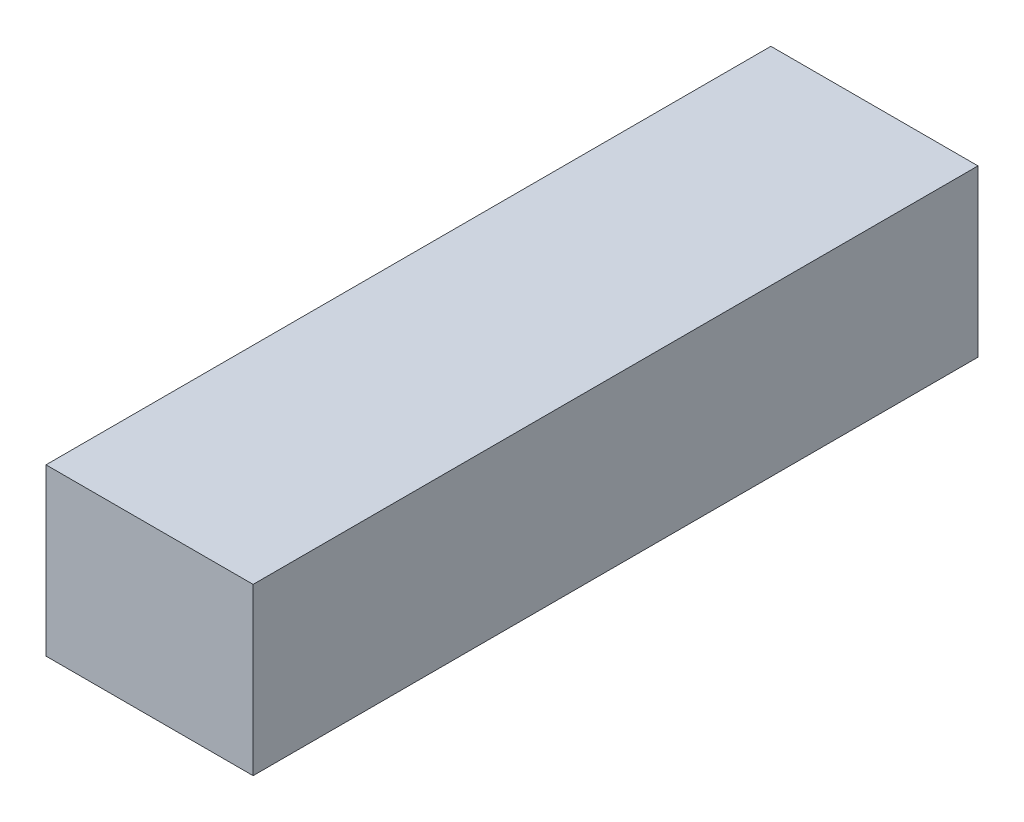
ISO-10303-21;
HEADER;
FILE_DESCRIPTION(('STEP AP214'),'2;1');
FILE_NAME('part.step','',(''),(''),'','','');
FILE_SCHEMA(('AUTOMOTIVE_DESIGN { 1 0 10303 214 1 1 1 1 }'));
ENDSEC;
DATA;
#1=APPLICATION_CONTEXT('core data for automotive mechanical design processes');
#2=APPLICATION_PROTOCOL_DEFINITION('international standard','automotive_design',2000,#1);
#3=PRODUCT_CONTEXT('',#1,'mechanical');
#4=PRODUCT('Part','Part','',(#3));
#5=PRODUCT_RELATED_PRODUCT_CATEGORY('part','',(#4));
#6=PRODUCT_DEFINITION_FORMATION('','',#4);
#7=PRODUCT_DEFINITION_CONTEXT('part definition',#1,'design');
#8=PRODUCT_DEFINITION('design','',#6,#7);
#9=PRODUCT_DEFINITION_SHAPE('','',#8);
#10=(LENGTH_UNIT() NAMED_UNIT(*) SI_UNIT(.MILLI.,.METRE.));
#11=(NAMED_UNIT(*) PLANE_ANGLE_UNIT() SI_UNIT($,.RADIAN.));
#12=(NAMED_UNIT(*) SI_UNIT($,.STERADIAN.) SOLID_ANGLE_UNIT());
#13=UNCERTAINTY_MEASURE_WITH_UNIT(LENGTH_MEASURE(1.E-05),#10,'distance_accuracy_value','');
#14=(GEOMETRIC_REPRESENTATION_CONTEXT(3) GLOBAL_UNCERTAINTY_ASSIGNED_CONTEXT((#13)) GLOBAL_UNIT_ASSIGNED_CONTEXT((#10,
#11,#12)) REPRESENTATION_CONTEXT('',''));
#15=CARTESIAN_POINT('',(0.,0.,0.));
#16=DIRECTION('',(0.,0.,1.));
#17=DIRECTION('',(1.,0.,0.));
#18=AXIS2_PLACEMENT_3D('',#15,#16,#17);
#19=CARTESIAN_POINT('',(-12.7,20.32,44.45));
#20=DIRECTION('',(0.,0.,-1.));
#21=DIRECTION('',(-1.,0.,0.));
#22=AXIS2_PLACEMENT_3D('',#19,#20,#21);
#23=PLANE('',#22);
#24=DIRECTION('',(1.,0.,0.));
#25=VECTOR('',#24,1.);
#26=CARTESIAN_POINT('',(-12.7,0.,44.45));
#27=LINE('',#26,#25);
#28=CARTESIAN_POINT('',(-12.7,0.,44.45));
#29=VERTEX_POINT('',#28);
#30=CARTESIAN_POINT('',(12.7,0.,44.45));
#31=VERTEX_POINT('',#30);
#32=EDGE_CURVE('E106',#29,#31,#27,.T.);
#33=ORIENTED_EDGE('',*,*,#32,.T.);
#34=DIRECTION('',(0.,-1.,0.));
#35=VECTOR('',#34,1.);
#36=CARTESIAN_POINT('',(12.7,20.32,44.45));
#37=LINE('',#36,#35);
#38=CARTESIAN_POINT('',(12.7,20.32,44.45));
#39=VERTEX_POINT('',#38);
#40=EDGE_CURVE('E11',#39,#31,#37,.T.);
#41=ORIENTED_EDGE('',*,*,#40,.F.);
#42=DIRECTION('',(1.,0.,0.));
#43=VECTOR('',#42,1.);
#44=CARTESIAN_POINT('',(-12.7,20.32,44.45));
#45=LINE('',#44,#43);
#46=CARTESIAN_POINT('',(-12.7,20.32,44.45));
#47=VERTEX_POINT('',#46);
#48=EDGE_CURVE('E93',#47,#39,#45,.T.);
#49=ORIENTED_EDGE('',*,*,#48,.F.);
#50=DIRECTION('',(0.,-1.,0.));
#51=VECTOR('',#50,1.);
#52=CARTESIAN_POINT('',(-12.7,20.32,44.45));
#53=LINE('',#52,#51);
#54=EDGE_CURVE('E62',#47,#29,#53,.T.);
#55=ORIENTED_EDGE('',*,*,#54,.T.);
#56=EDGE_LOOP('',(#33,#41,#49,#55));
#57=FACE_BOUND('',#56,.T.);
#58=ADVANCED_FACE('F44',(#57),#23,.F.);
#59=CARTESIAN_POINT('',(12.7,20.32,44.45));
#60=DIRECTION('',(-1.,0.,0.));
#61=DIRECTION('',(0.,0.,1.));
#62=AXIS2_PLACEMENT_3D('',#59,#60,#61);
#63=PLANE('',#62);
#64=DIRECTION('',(0.,0.,-1.));
#65=VECTOR('',#64,1.);
#66=CARTESIAN_POINT('',(12.7,0.,44.45));
#67=LINE('',#66,#65);
#68=CARTESIAN_POINT('',(12.7,0.,-44.45));
#69=VERTEX_POINT('',#68);
#70=EDGE_CURVE('E96',#31,#69,#67,.T.);
#71=ORIENTED_EDGE('',*,*,#70,.T.);
#72=DIRECTION('',(0.,-1.,0.));
#73=VECTOR('',#72,1.);
#74=CARTESIAN_POINT('',(12.7,20.32,-44.45));
#75=LINE('',#74,#73);
#76=CARTESIAN_POINT('',(12.7,20.32,-44.45));
#77=VERTEX_POINT('',#76);
#78=EDGE_CURVE('E52',#77,#69,#75,.T.);
#79=ORIENTED_EDGE('',*,*,#78,.F.);
#80=DIRECTION('',(0.,0.,-1.));
#81=VECTOR('',#80,1.);
#82=CARTESIAN_POINT('',(12.7,20.32,44.45));
#83=LINE('',#82,#81);
#84=EDGE_CURVE('E87',#39,#77,#83,.T.);
#85=ORIENTED_EDGE('',*,*,#84,.F.);
#86=ORIENTED_EDGE('',*,*,#40,.T.);
#87=EDGE_LOOP('',(#71,#79,#85,#86));
#88=FACE_BOUND('',#87,.T.);
#89=ADVANCED_FACE('F100',(#88),#63,.F.);
#90=CARTESIAN_POINT('',(-12.7,20.32,-44.45));
#91=DIRECTION('',(0.,0.,-1.));
#92=DIRECTION('',(-1.,0.,0.));
#93=AXIS2_PLACEMENT_3D('',#90,#91,#92);
#94=PLANE('',#93);
#95=DIRECTION('',(1.,0.,0.));
#96=VECTOR('',#95,1.);
#97=CARTESIAN_POINT('',(-12.7,0.,-44.45));
#98=LINE('',#97,#96);
#99=CARTESIAN_POINT('',(-12.7,0.,-44.45));
#100=VERTEX_POINT('',#99);
#101=EDGE_CURVE('E113',#100,#69,#98,.T.);
#102=ORIENTED_EDGE('',*,*,#101,.F.);
#103=DIRECTION('',(0.,-1.,0.));
#104=VECTOR('',#103,1.);
#105=CARTESIAN_POINT('',(-12.7,20.32,-44.45));
#106=LINE('',#105,#104);
#107=CARTESIAN_POINT('',(-12.7,20.32,-44.45));
#108=VERTEX_POINT('',#107);
#109=EDGE_CURVE('E73',#108,#100,#106,.T.);
#110=ORIENTED_EDGE('',*,*,#109,.F.);
#111=DIRECTION('',(1.,0.,0.));
#112=VECTOR('',#111,1.);
#113=CARTESIAN_POINT('',(-12.7,20.32,-44.45));
#114=LINE('',#113,#112);
#115=EDGE_CURVE('E92',#108,#77,#114,.T.);
#116=ORIENTED_EDGE('',*,*,#115,.T.);
#117=ORIENTED_EDGE('',*,*,#78,.T.);
#118=EDGE_LOOP('',(#102,#110,#116,#117));
#119=FACE_BOUND('',#118,.T.);
#120=ADVANCED_FACE('F105',(#119),#94,.T.);
#121=CARTESIAN_POINT('',(-12.7,20.32,44.45));
#122=DIRECTION('',(-1.,0.,0.));
#123=DIRECTION('',(0.,0.,1.));
#124=AXIS2_PLACEMENT_3D('',#121,#122,#123);
#125=PLANE('',#124);
#126=DIRECTION('',(0.,0.,-1.));
#127=VECTOR('',#126,1.);
#128=CARTESIAN_POINT('',(-12.7,0.,44.45));
#129=LINE('',#128,#127);
#130=EDGE_CURVE('E111',#29,#100,#129,.T.);
#131=ORIENTED_EDGE('',*,*,#130,.F.);
#132=ORIENTED_EDGE('',*,*,#54,.F.);
#133=DIRECTION('',(0.,0.,-1.));
#134=VECTOR('',#133,1.);
#135=CARTESIAN_POINT('',(-12.7,20.32,44.45));
#136=LINE('',#135,#134);
#137=EDGE_CURVE('E102',#47,#108,#136,.T.);
#138=ORIENTED_EDGE('',*,*,#137,.T.);
#139=ORIENTED_EDGE('',*,*,#109,.T.);
#140=EDGE_LOOP('',(#131,#132,#138,#139));
#141=FACE_BOUND('',#140,.T.);
#142=ADVANCED_FACE('F119',(#141),#125,.T.);
#143=CARTESIAN_POINT('',(0.,20.32,0.));
#144=DIRECTION('',(0.,1.,0.));
#145=DIRECTION('',(0.,0.,1.));
#146=AXIS2_PLACEMENT_3D('',#143,#144,#145);
#147=PLANE('',#146);
#148=ORIENTED_EDGE('',*,*,#48,.T.);
#149=ORIENTED_EDGE('',*,*,#84,.T.);
#150=ORIENTED_EDGE('',*,*,#115,.F.);
#151=ORIENTED_EDGE('',*,*,#137,.F.);
#152=EDGE_LOOP('',(#148,#149,#150,#151));
#153=FACE_BOUND('',#152,.T.);
#154=ADVANCED_FACE('F88',(#153),#147,.T.);
#155=CARTESIAN_POINT('',(0.,0.,0.));
#156=DIRECTION('',(0.,1.,0.));
#157=DIRECTION('',(0.,0.,1.));
#158=AXIS2_PLACEMENT_3D('',#155,#156,#157);
#159=PLANE('',#158);
#160=ORIENTED_EDGE('',*,*,#32,.F.);
#161=ORIENTED_EDGE('',*,*,#130,.T.);
#162=ORIENTED_EDGE('',*,*,#101,.T.);
#163=ORIENTED_EDGE('',*,*,#70,.F.);
#164=EDGE_LOOP('',(#160,#161,#162,#163));
#165=FACE_BOUND('',#164,.T.);
#166=ADVANCED_FACE('F117',(#165),#159,.F.);
#167=CLOSED_SHELL('',(#58,#89,#120,#142,#154,#166));
#168=MANIFOLD_SOLID_BREP('B2',#167);
#169=ADVANCED_BREP_SHAPE_REPRESENTATION('',(#18,#168),#14);
#170=SHAPE_DEFINITION_REPRESENTATION(#9,#169);
ENDSEC;
END-ISO-10303-21;
